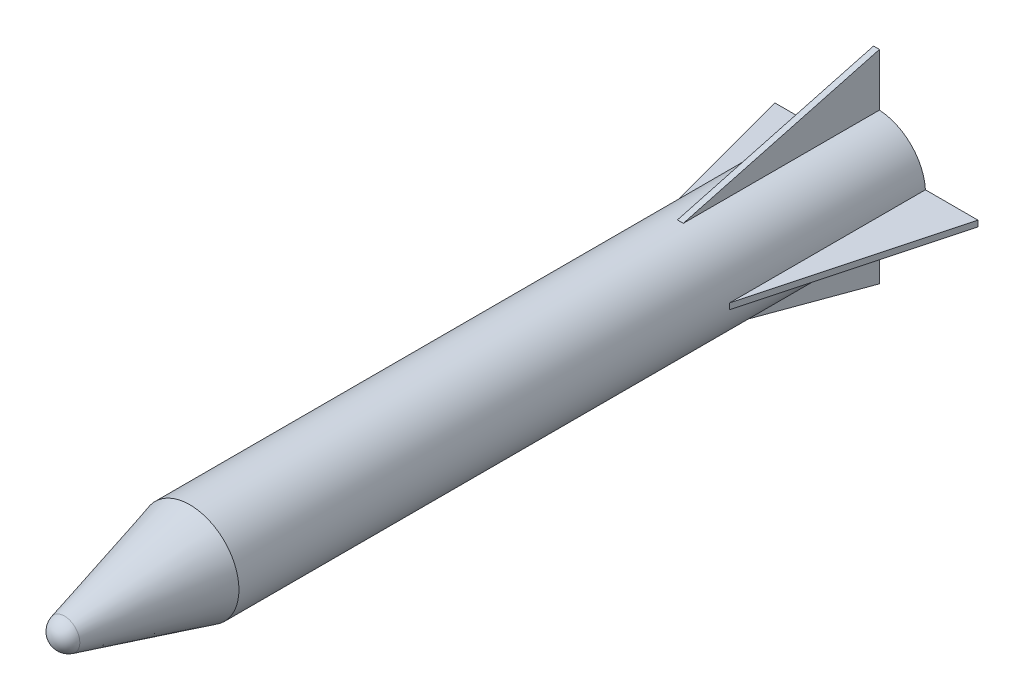
ISO-10303-21;
HEADER;
FILE_DESCRIPTION(('STEP AP214'),'2;1');
FILE_NAME('part.step','',(''),(''),'','','');
FILE_SCHEMA(('AUTOMOTIVE_DESIGN { 1 0 10303 214 1 1 1 1 }'));
ENDSEC;
DATA;
#1=APPLICATION_CONTEXT('core data for automotive mechanical design processes');
#2=APPLICATION_PROTOCOL_DEFINITION('international standard','automotive_design',2000,#1);
#3=PRODUCT_CONTEXT('',#1,'mechanical');
#4=PRODUCT('Part','Part','',(#3));
#5=PRODUCT_RELATED_PRODUCT_CATEGORY('part','',(#4));
#6=PRODUCT_DEFINITION_FORMATION('','',#4);
#7=PRODUCT_DEFINITION_CONTEXT('part definition',#1,'design');
#8=PRODUCT_DEFINITION('design','',#6,#7);
#9=PRODUCT_DEFINITION_SHAPE('','',#8);
#10=(LENGTH_UNIT() NAMED_UNIT(*) SI_UNIT(.MILLI.,.METRE.));
#11=(NAMED_UNIT(*) PLANE_ANGLE_UNIT() SI_UNIT($,.RADIAN.));
#12=(NAMED_UNIT(*) SI_UNIT($,.STERADIAN.) SOLID_ANGLE_UNIT());
#13=UNCERTAINTY_MEASURE_WITH_UNIT(LENGTH_MEASURE(1.E-05),#10,'distance_accuracy_value','');
#14=(GEOMETRIC_REPRESENTATION_CONTEXT(3) GLOBAL_UNCERTAINTY_ASSIGNED_CONTEXT((#13)) GLOBAL_UNIT_ASSIGNED_CONTEXT((#10,
#11,#12)) REPRESENTATION_CONTEXT('',''));
#15=CARTESIAN_POINT('',(0.,0.,0.));
#16=DIRECTION('',(0.,0.,1.));
#17=DIRECTION('',(1.,0.,0.));
#18=AXIS2_PLACEMENT_3D('',#15,#16,#17);
#19=CARTESIAN_POINT('',(0.,-9.5,0.));
#20=DIRECTION('',(0.,0.,1.));
#21=DIRECTION('',(1.,0.,0.));
#22=AXIS2_PLACEMENT_3D('',#19,#20,#21);
#23=PLANE('',#22);
#24=CARTESIAN_POINT('',(0.,0.,0.));
#25=DIRECTION('',(0.,0.,-1.));
#26=DIRECTION('',(-1.,0.,0.));
#27=AXIS2_PLACEMENT_3D('',#24,#25,#26);
#28=CIRCLE('',#27,9.5);
#29=CARTESIAN_POINT('',(-9.5,0.,0.));
#30=VERTEX_POINT('',#29);
#31=EDGE_CURVE('E11',#30,#30,#28,.T.);
#32=ORIENTED_EDGE('',*,*,#31,.F.);
#33=EDGE_LOOP('',(#32));
#34=FACE_BOUND('',#33,.T.);
#35=DIRECTION('',(-1.,0.,0.));
#36=VECTOR('',#35,1.);
#37=CARTESIAN_POINT('',(25.8759393350242,25.8749393350242,0.));
#38=LINE('',#37,#36);
#39=CARTESIAN_POINT('',(0.749999999999897,25.8749393350242,0.));
#40=VERTEX_POINT('',#39);
#41=CARTESIAN_POINT('',(0.,25.8749393350242,0.));
#42=VERTEX_POINT('',#41);
#43=EDGE_CURVE('E177',#40,#42,#38,.T.);
#44=ORIENTED_EDGE('',*,*,#43,.F.);
#45=DIRECTION('',(0.,1.,0.));
#46=VECTOR('',#45,1.);
#47=CARTESIAN_POINT('',(0.750000000000045,-12.502,0.));
#48=LINE('',#47,#46);
#49=CARTESIAN_POINT('',(0.749999999999957,12.4774797134678,0.));
#50=VERTEX_POINT('',#49);
#51=EDGE_CURVE('E64',#50,#40,#48,.T.);
#52=ORIENTED_EDGE('',*,*,#51,.F.);
#53=CARTESIAN_POINT('',(0.,0.,0.));
#54=DIRECTION('',(0.,0.,-1.));
#55=DIRECTION('',(-1.,0.,0.));
#56=AXIS2_PLACEMENT_3D('',#53,#54,#55);
#57=CIRCLE('',#56,12.5);
#58=CARTESIAN_POINT('',(12.4774797134678,0.750000000000001,0.));
#59=VERTEX_POINT('',#58);
#60=EDGE_CURVE('E284',#50,#59,#57,.T.);
#61=ORIENTED_EDGE('',*,*,#60,.T.);
#62=DIRECTION('',(1.,0.,0.));
#63=VECTOR('',#62,1.);
#64=CARTESIAN_POINT('',(-12.502,0.750000000000001,0.));
#65=LINE('',#64,#63);
#66=CARTESIAN_POINT('',(25.8749393350242,0.750000000000001,0.));
#67=VERTEX_POINT('',#66);
#68=EDGE_CURVE('E256',#59,#67,#65,.T.);
#69=ORIENTED_EDGE('',*,*,#68,.T.);
#70=DIRECTION('',(0.,1.,0.));
#71=VECTOR('',#70,1.);
#72=CARTESIAN_POINT('',(25.8749393350242,-12.501,0.));
#73=LINE('',#72,#71);
#74=CARTESIAN_POINT('',(25.8749393350242,0.,0.));
#75=VERTEX_POINT('',#74);
#76=EDGE_CURVE('E244',#75,#67,#73,.T.);
#77=ORIENTED_EDGE('',*,*,#76,.F.);
#78=CARTESIAN_POINT('',(25.8749393350242,-0.750000000000001,0.));
#79=VERTEX_POINT('',#78);
#80=EDGE_CURVE('E245',#79,#75,#73,.T.);
#81=ORIENTED_EDGE('',*,*,#80,.F.);
#82=DIRECTION('',(1.,0.,0.));
#83=VECTOR('',#82,1.);
#84=CARTESIAN_POINT('',(-12.502,-0.750000000000001,0.));
#85=LINE('',#84,#83);
#86=CARTESIAN_POINT('',(12.4774797134678,-0.750000000000001,0.));
#87=VERTEX_POINT('',#86);
#88=EDGE_CURVE('E261',#87,#79,#85,.T.);
#89=ORIENTED_EDGE('',*,*,#88,.F.);
#90=CARTESIAN_POINT('',(0.750000000000132,-12.4774797134678,0.));
#91=VERTEX_POINT('',#90);
#92=EDGE_CURVE('E57',#87,#91,#57,.T.);
#93=ORIENTED_EDGE('',*,*,#92,.T.);
#94=DIRECTION('',(0.,-1.,0.));
#95=VECTOR('',#94,1.);
#96=CARTESIAN_POINT('',(0.74999999999987,12.502,0.));
#97=LINE('',#96,#95);
#98=CARTESIAN_POINT('',(0.750000000000272,-25.8749393350241,0.));
#99=VERTEX_POINT('',#98);
#100=EDGE_CURVE('E225',#91,#99,#97,.T.);
#101=ORIENTED_EDGE('',*,*,#100,.T.);
#102=DIRECTION('',(1.,0.,0.));
#103=VECTOR('',#102,1.);
#104=CARTESIAN_POINT('',(-33.0010000000001,-25.8749393350245,0.));
#105=LINE('',#104,#103);
#106=CARTESIAN_POINT('',(2.35922392732846E-13,-25.8749393350242,0.));
#107=VERTEX_POINT('',#106);
#108=EDGE_CURVE('E318',#107,#99,#105,.T.);
#109=ORIENTED_EDGE('',*,*,#108,.F.);
#110=CARTESIAN_POINT('',(-0.749999999999695,-25.8749393350242,0.));
#111=VERTEX_POINT('',#110);
#112=EDGE_CURVE('E305',#111,#107,#105,.T.);
#113=ORIENTED_EDGE('',*,*,#112,.F.);
#114=DIRECTION('',(0.,-1.,0.));
#115=VECTOR('',#114,1.);
#116=CARTESIAN_POINT('',(-0.750000000000132,12.502,0.));
#117=LINE('',#116,#115);
#118=CARTESIAN_POINT('',(-0.749999999999871,-12.4774797134678,0.));
#119=VERTEX_POINT('',#118);
#120=EDGE_CURVE('E233',#119,#111,#117,.T.);
#121=ORIENTED_EDGE('',*,*,#120,.F.);
#122=CARTESIAN_POINT('',(-12.4774797134678,-0.750000000000001,0.));
#123=VERTEX_POINT('',#122);
#124=EDGE_CURVE('E286',#119,#123,#57,.T.);
#125=ORIENTED_EDGE('',*,*,#124,.T.);
#126=DIRECTION('',(-1.,0.,0.));
#127=VECTOR('',#126,1.);
#128=CARTESIAN_POINT('',(25.8769393350242,-0.750000000000001,0.));
#129=LINE('',#128,#127);
#130=CARTESIAN_POINT('',(-25.8749393350242,-0.750000000000001,0.));
#131=VERTEX_POINT('',#130);
#132=EDGE_CURVE('E216',#123,#131,#129,.T.);
#133=ORIENTED_EDGE('',*,*,#132,.T.);
#134=DIRECTION('',(0.,-1.,0.));
#135=VECTOR('',#134,1.);
#136=CARTESIAN_POINT('',(-25.8749393350242,33.001,0.));
#137=LINE('',#136,#135);
#138=CARTESIAN_POINT('',(-25.8749393350242,0.,0.));
#139=VERTEX_POINT('',#138);
#140=EDGE_CURVE('E303',#139,#131,#137,.T.);
#141=ORIENTED_EDGE('',*,*,#140,.F.);
#142=CARTESIAN_POINT('',(-25.8749393350242,0.750000000000001,0.));
#143=VERTEX_POINT('',#142);
#144=EDGE_CURVE('E310',#143,#139,#137,.T.);
#145=ORIENTED_EDGE('',*,*,#144,.F.);
#146=DIRECTION('',(-1.,0.,0.));
#147=VECTOR('',#146,1.);
#148=CARTESIAN_POINT('',(25.8769393350242,0.750000000000001,0.));
#149=LINE('',#148,#147);
#150=CARTESIAN_POINT('',(-12.4774797134678,0.750000000000001,0.));
#151=VERTEX_POINT('',#150);
#152=EDGE_CURVE('E71',#151,#143,#149,.T.);
#153=ORIENTED_EDGE('',*,*,#152,.F.);
#154=CARTESIAN_POINT('',(-0.750000000000045,12.4774797134678,0.));
#155=VERTEX_POINT('',#154);
#156=EDGE_CURVE('E289',#151,#155,#57,.T.);
#157=ORIENTED_EDGE('',*,*,#156,.T.);
#158=DIRECTION('',(0.,1.,0.));
#159=VECTOR('',#158,1.);
#160=CARTESIAN_POINT('',(-0.749999999999958,-12.502,0.));
#161=LINE('',#160,#159);
#162=CARTESIAN_POINT('',(-0.750000000000091,25.8749393350242,0.));
#163=VERTEX_POINT('',#162);
#164=EDGE_CURVE('E192',#155,#163,#161,.T.);
#165=ORIENTED_EDGE('',*,*,#164,.T.);
#166=EDGE_CURVE('E184',#42,#163,#38,.T.);
#167=ORIENTED_EDGE('',*,*,#166,.F.);
#168=EDGE_LOOP('',(#44,#52,#61,#69,#77,#81,#89,#93,#101,#109,#113,#121,#125,#133,#141,#145,#153,
#157,#165,#167));
#169=FACE_BOUND('',#168,.T.);
#170=ADVANCED_FACE('F48',(#34,#169),#23,.F.);
#171=CARTESIAN_POINT('',(0.749999999999866,12.502,50.));
#172=DIRECTION('',(1.,0.,0.));
#173=DIRECTION('',(0.,1.,0.));
#174=AXIS2_PLACEMENT_3D('',#171,#172,#173);
#175=PLANE('',#174);
#176=DIRECTION('',(0.,0.,-1.));
#177=VECTOR('',#176,1.);
#178=CARTESIAN_POINT('',(0.750000000000132,-12.4774797134678,0.));
#179=LINE('',#178,#177);
#180=CARTESIAN_POINT('',(0.750000000000125,-12.4774797134678,50.));
#181=VERTEX_POINT('',#180);
#182=EDGE_CURVE('E176',#91,#181,#179,.F.);
#183=ORIENTED_EDGE('',*,*,#182,.T.);
#184=DIRECTION('',(0.,-0.258819045102525,-0.965925826289067));
#185=VECTOR('',#184,1.);
#186=CARTESIAN_POINT('',(0.750000000000125,-12.4774797134678,50.));
#187=LINE('',#186,#185);
#188=EDGE_CURVE('E315',#181,#99,#187,.T.);
#189=ORIENTED_EDGE('',*,*,#188,.T.);
#190=ORIENTED_EDGE('',*,*,#100,.F.);
#191=EDGE_LOOP('',(#183,#189,#190));
#192=FACE_BOUND('',#191,.T.);
#193=ADVANCED_FACE('F339',(#192),#175,.T.);
#194=CARTESIAN_POINT('',(-0.750000000000132,12.502,0.));
#195=DIRECTION('',(-1.,0.,0.));
#196=DIRECTION('',(0.,-1.,0.));
#197=AXIS2_PLACEMENT_3D('',#194,#195,#196);
#198=PLANE('',#197);
#199=ORIENTED_EDGE('',*,*,#120,.T.);
#200=DIRECTION('',(0.,-0.258819045102525,-0.965925826289067));
#201=VECTOR('',#200,1.);
#202=CARTESIAN_POINT('',(-0.749999999999869,-12.4774797134678,50.));
#203=LINE('',#202,#201);
#204=CARTESIAN_POINT('',(-0.749999999999871,-12.4774797134678,50.));
#205=VERTEX_POINT('',#204);
#206=EDGE_CURVE('E313',#205,#111,#203,.T.);
#207=ORIENTED_EDGE('',*,*,#206,.F.);
#208=DIRECTION('',(0.,0.,-1.));
#209=VECTOR('',#208,1.);
#210=CARTESIAN_POINT('',(-0.749999999999871,-12.4774797134678,0.));
#211=LINE('',#210,#209);
#212=EDGE_CURVE('E222',#205,#119,#211,.T.);
#213=ORIENTED_EDGE('',*,*,#212,.T.);
#214=EDGE_LOOP('',(#199,#207,#213));
#215=FACE_BOUND('',#214,.T.);
#216=ADVANCED_FACE('F346',(#215),#198,.T.);
#217=CARTESIAN_POINT('',(25.8769393350242,-0.749999999999997,50.));
#218=DIRECTION('',(0.,-1.,0.));
#219=DIRECTION('',(0.,0.,-1.));
#220=AXIS2_PLACEMENT_3D('',#217,#218,#219);
#221=PLANE('',#220);
#222=DIRECTION('',(0.,0.,-1.));
#223=VECTOR('',#222,1.);
#224=CARTESIAN_POINT('',(-12.4774797134678,-0.750000000000001,0.));
#225=LINE('',#224,#223);
#226=CARTESIAN_POINT('',(-12.4774797134678,-0.749999999999995,50.));
#227=VERTEX_POINT('',#226);
#228=EDGE_CURVE('E207',#123,#227,#225,.F.);
#229=ORIENTED_EDGE('',*,*,#228,.T.);
#230=DIRECTION('',(-0.258819045102525,0.,-0.965925826289067));
#231=VECTOR('',#230,1.);
#232=CARTESIAN_POINT('',(-12.4774797134678,-0.749999999999995,50.));
#233=LINE('',#232,#231);
#234=EDGE_CURVE('E299',#227,#131,#233,.T.);
#235=ORIENTED_EDGE('',*,*,#234,.T.);
#236=ORIENTED_EDGE('',*,*,#132,.F.);
#237=EDGE_LOOP('',(#229,#235,#236));
#238=FACE_BOUND('',#237,.T.);
#239=ADVANCED_FACE('F350',(#238),#221,.T.);
#240=CARTESIAN_POINT('',(25.8769393350242,0.750000000000001,0.));
#241=DIRECTION('',(0.,1.,0.));
#242=DIRECTION('',(0.,0.,1.));
#243=AXIS2_PLACEMENT_3D('',#240,#241,#242);
#244=PLANE('',#243);
#245=ORIENTED_EDGE('',*,*,#152,.T.);
#246=DIRECTION('',(-0.258819045102525,0.,-0.965925826289067));
#247=VECTOR('',#246,1.);
#248=CARTESIAN_POINT('',(-12.4774797134678,0.750000000000001,50.));
#249=LINE('',#248,#247);
#250=CARTESIAN_POINT('',(-12.4774797134678,0.750000000000001,50.));
#251=VERTEX_POINT('',#250);
#252=EDGE_CURVE('E297',#251,#143,#249,.T.);
#253=ORIENTED_EDGE('',*,*,#252,.F.);
#254=DIRECTION('',(0.,0.,-1.));
#255=VECTOR('',#254,1.);
#256=CARTESIAN_POINT('',(-12.4774797134678,0.750000000000001,0.));
#257=LINE('',#256,#255);
#258=EDGE_CURVE('E214',#251,#151,#257,.T.);
#259=ORIENTED_EDGE('',*,*,#258,.T.);
#260=EDGE_LOOP('',(#245,#253,#259));
#261=FACE_BOUND('',#260,.T.);
#262=ADVANCED_FACE('F296',(#261),#244,.T.);
#263=CARTESIAN_POINT('',(-0.749999999999953,-12.502,50.));
#264=DIRECTION('',(-1.,0.,0.));
#265=DIRECTION('',(0.,-1.,0.));
#266=AXIS2_PLACEMENT_3D('',#263,#264,#265);
#267=PLANE('',#266);
#268=DIRECTION('',(0.,0.,-1.));
#269=VECTOR('',#268,1.);
#270=CARTESIAN_POINT('',(-0.750000000000045,12.4774797134678,0.));
#271=LINE('',#270,#269);
#272=CARTESIAN_POINT('',(-0.750000000000038,12.4774797134678,50.));
#273=VERTEX_POINT('',#272);
#274=EDGE_CURVE('E190',#155,#273,#271,.F.);
#275=ORIENTED_EDGE('',*,*,#274,.T.);
#276=DIRECTION('',(0.,0.258819045102525,-0.965925826289067));
#277=VECTOR('',#276,1.);
#278=CARTESIAN_POINT('',(-0.750000000000038,12.4774797134678,50.));
#279=LINE('',#278,#277);
#280=EDGE_CURVE('E180',#273,#163,#279,.T.);
#281=ORIENTED_EDGE('',*,*,#280,.T.);
#282=ORIENTED_EDGE('',*,*,#164,.F.);
#283=EDGE_LOOP('',(#275,#281,#282));
#284=FACE_BOUND('',#283,.T.);
#285=ADVANCED_FACE('F191',(#284),#267,.T.);
#286=CARTESIAN_POINT('',(0.750000000000045,-12.502,0.));
#287=DIRECTION('',(1.,0.,0.));
#288=DIRECTION('',(0.,1.,0.));
#289=AXIS2_PLACEMENT_3D('',#286,#287,#288);
#290=PLANE('',#289);
#291=ORIENTED_EDGE('',*,*,#51,.T.);
#292=DIRECTION('',(0.,0.258819045102525,-0.965925826289067));
#293=VECTOR('',#292,1.);
#294=CARTESIAN_POINT('',(0.749999999999959,12.4774797134678,50.));
#295=LINE('',#294,#293);
#296=CARTESIAN_POINT('',(0.749999999999958,12.4774797134678,50.));
#297=VERTEX_POINT('',#296);
#298=EDGE_CURVE('E187',#297,#40,#295,.T.);
#299=ORIENTED_EDGE('',*,*,#298,.F.);
#300=DIRECTION('',(0.,0.,-1.));
#301=VECTOR('',#300,1.);
#302=CARTESIAN_POINT('',(0.749999999999957,12.4774797134678,0.));
#303=LINE('',#302,#301);
#304=EDGE_CURVE('E201',#297,#50,#303,.T.);
#305=ORIENTED_EDGE('',*,*,#304,.T.);
#306=EDGE_LOOP('',(#291,#299,#305));
#307=FACE_BOUND('',#306,.T.);
#308=ADVANCED_FACE('F322',(#307),#290,.T.);
#309=CARTESIAN_POINT('',(-12.502,0.749999999999997,50.));
#310=DIRECTION('',(0.,1.,0.));
#311=DIRECTION('',(0.,0.,1.));
#312=AXIS2_PLACEMENT_3D('',#309,#310,#311);
#313=PLANE('',#312);
#314=DIRECTION('',(0.,0.,-1.));
#315=VECTOR('',#314,1.);
#316=CARTESIAN_POINT('',(12.4774797134678,0.750000000000001,0.));
#317=LINE('',#316,#315);
#318=CARTESIAN_POINT('',(12.4774797134678,0.749999999999995,50.));
#319=VERTEX_POINT('',#318);
#320=EDGE_CURVE('E249',#59,#319,#317,.F.);
#321=ORIENTED_EDGE('',*,*,#320,.T.);
#322=DIRECTION('',(0.258819045102525,0.,-0.965925826289067));
#323=VECTOR('',#322,1.);
#324=CARTESIAN_POINT('',(12.4774797134678,0.749999999999995,50.));
#325=LINE('',#324,#323);
#326=EDGE_CURVE('E240',#319,#67,#325,.T.);
#327=ORIENTED_EDGE('',*,*,#326,.T.);
#328=ORIENTED_EDGE('',*,*,#68,.F.);
#329=EDGE_LOOP('',(#321,#327,#328));
#330=FACE_BOUND('',#329,.T.);
#331=ADVANCED_FACE('F327',(#330),#313,.T.);
#332=CARTESIAN_POINT('',(-12.502,-0.750000000000001,0.));
#333=DIRECTION('',(0.,-1.,0.));
#334=DIRECTION('',(0.,0.,-1.));
#335=AXIS2_PLACEMENT_3D('',#332,#333,#334);
#336=PLANE('',#335);
#337=ORIENTED_EDGE('',*,*,#88,.T.);
#338=DIRECTION('',(0.258819045102525,0.,-0.965925826289067));
#339=VECTOR('',#338,1.);
#340=CARTESIAN_POINT('',(12.4774797134678,-0.750000000000001,50.));
#341=LINE('',#340,#339);
#342=CARTESIAN_POINT('',(12.4774797134678,-0.750000000000001,50.));
#343=VERTEX_POINT('',#342);
#344=EDGE_CURVE('E238',#343,#79,#341,.T.);
#345=ORIENTED_EDGE('',*,*,#344,.F.);
#346=DIRECTION('',(0.,0.,-1.));
#347=VECTOR('',#346,1.);
#348=CARTESIAN_POINT('',(12.4774797134678,-0.750000000000001,0.));
#349=LINE('',#348,#347);
#350=EDGE_CURVE('E253',#343,#87,#349,.T.);
#351=ORIENTED_EDGE('',*,*,#350,.T.);
#352=EDGE_LOOP('',(#337,#345,#351));
#353=FACE_BOUND('',#352,.T.);
#354=ADVANCED_FACE('F334',(#353),#336,.T.);
#355=CARTESIAN_POINT('',(0.,0.,0.));
#356=DIRECTION('',(0.,0.,-1.));
#357=DIRECTION('',(-1.,0.,0.));
#358=AXIS2_PLACEMENT_3D('',#355,#356,#357);
#359=CYLINDRICAL_SURFACE('',#358,9.5);
#360=CARTESIAN_POINT('',(0.,0.,70.));
#361=DIRECTION('',(0.,0.,-1.));
#362=DIRECTION('',(-1.,0.,0.));
#363=AXIS2_PLACEMENT_3D('',#360,#361,#362);
#364=CIRCLE('',#363,9.5);
#365=CARTESIAN_POINT('',(-9.5,0.,70.));
#366=VERTEX_POINT('',#365);
#367=EDGE_CURVE('E260',#366,#366,#364,.T.);
#368=ORIENTED_EDGE('',*,*,#367,.F.);
#369=EDGE_LOOP('',(#368));
#370=FACE_BOUND('',#369,.T.);
#371=ORIENTED_EDGE('',*,*,#31,.T.);
#372=EDGE_LOOP('',(#371));
#373=FACE_BOUND('',#372,.T.);
#374=ADVANCED_FACE('F50',(#370,#373),#359,.F.);
#375=CARTESIAN_POINT('',(0.,0.,0.));
#376=DIRECTION('',(0.,0.,-1.));
#377=DIRECTION('',(-1.,0.,0.));
#378=AXIS2_PLACEMENT_3D('',#375,#376,#377);
#379=CYLINDRICAL_SURFACE('',#378,12.5);
#380=CARTESIAN_POINT('',(0.,0.,50.));
#381=DIRECTION('',(0.,0.,1.));
#382=DIRECTION('',(1.,0.,0.));
#383=AXIS2_PLACEMENT_3D('',#380,#381,#382);
#384=CIRCLE('',#383,12.5);
#385=EDGE_CURVE('E173',#273,#297,#384,.F.);
#386=ORIENTED_EDGE('',*,*,#385,.F.);
#387=ORIENTED_EDGE('',*,*,#274,.F.);
#388=ORIENTED_EDGE('',*,*,#156,.F.);
#389=ORIENTED_EDGE('',*,*,#258,.F.);
#390=CARTESIAN_POINT('',(0.,0.,50.));
#391=DIRECTION('',(0.,0.,1.));
#392=DIRECTION('',(1.,0.,0.));
#393=AXIS2_PLACEMENT_3D('',#390,#391,#392);
#394=CIRCLE('',#393,12.5);
#395=EDGE_CURVE('E210',#227,#251,#394,.F.);
#396=ORIENTED_EDGE('',*,*,#395,.F.);
#397=ORIENTED_EDGE('',*,*,#228,.F.);
#398=ORIENTED_EDGE('',*,*,#124,.F.);
#399=ORIENTED_EDGE('',*,*,#212,.F.);
#400=CARTESIAN_POINT('',(0.,0.,50.));
#401=DIRECTION('',(0.,0.,1.));
#402=DIRECTION('',(1.,0.,0.));
#403=AXIS2_PLACEMENT_3D('',#400,#401,#402);
#404=CIRCLE('',#403,12.5);
#405=EDGE_CURVE('E226',#181,#205,#404,.F.);
#406=ORIENTED_EDGE('',*,*,#405,.F.);
#407=ORIENTED_EDGE('',*,*,#182,.F.);
#408=ORIENTED_EDGE('',*,*,#92,.F.);
#409=ORIENTED_EDGE('',*,*,#350,.F.);
#410=CARTESIAN_POINT('',(0.,0.,50.));
#411=DIRECTION('',(0.,0.,1.));
#412=DIRECTION('',(1.,0.,0.));
#413=AXIS2_PLACEMENT_3D('',#410,#411,#412);
#414=CIRCLE('',#413,12.5);
#415=EDGE_CURVE('E252',#319,#343,#414,.F.);
#416=ORIENTED_EDGE('',*,*,#415,.F.);
#417=ORIENTED_EDGE('',*,*,#320,.F.);
#418=ORIENTED_EDGE('',*,*,#60,.F.);
#419=ORIENTED_EDGE('',*,*,#304,.F.);
#420=EDGE_LOOP('',(#386,#387,#388,#389,#396,#397,#398,#399,#406,#407,#408,#409,#416,#417,#418,#419));
#421=FACE_BOUND('',#420,.T.);
#422=CARTESIAN_POINT('',(0.,0.,175.));
#423=DIRECTION('',(0.,0.,-1.));
#424=DIRECTION('',(-1.,0.,0.));
#425=AXIS2_PLACEMENT_3D('',#422,#423,#424);
#426=CIRCLE('',#425,12.5);
#427=CARTESIAN_POINT('',(-12.5,0.,175.));
#428=VERTEX_POINT('',#427);
#429=EDGE_CURVE('E282',#428,#428,#426,.T.);
#430=ORIENTED_EDGE('',*,*,#429,.T.);
#431=EDGE_LOOP('',(#430));
#432=FACE_BOUND('',#431,.T.);
#433=ADVANCED_FACE('F198',(#421,#432),#379,.T.);
#434=CARTESIAN_POINT('',(0.,0.,206.984593749975));
#435=DIRECTION('',(0.,0.,-1.));
#436=DIRECTION('',(-1.,0.,0.));
#437=AXIS2_PLACEMENT_3D('',#434,#435,#436);
#438=CONICAL_SURFACE('',#437,3.92975393445672,0.26179938779915);
#439=CARTESIAN_POINT('',(0.,0.,206.984593749975));
#440=DIRECTION('',(0.,0.,-1.));
#441=DIRECTION('',(-1.,0.,0.));
#442=AXIS2_PLACEMENT_3D('',#439,#440,#441);
#443=CIRCLE('',#442,3.92975393445672);
#444=CARTESIAN_POINT('',(-3.92975393445672,0.,206.984593749975));
#445=VERTEX_POINT('',#444);
#446=EDGE_CURVE('E279',#445,#445,#443,.T.);
#447=CARTESIAN_POINT('',(-12.5,0.,175.));
#448=CARTESIAN_POINT('',(-12.410726603484,0.,175.333172851562));
#449=CARTESIAN_POINT('',(-12.3214532069679,0.,175.666345703124));
#450=CARTESIAN_POINT('',(-12.1429064139357,0.,176.332691406249));
#451=CARTESIAN_POINT('',(-12.0536330174196,0.,176.665864257811));
#452=CARTESIAN_POINT('',(-11.8750862243875,0.,177.332209960936));
#453=CARTESIAN_POINT('',(-11.7858128278714,0.,177.665382812498));
#454=CARTESIAN_POINT('',(-11.6072660348393,0.,178.331728515622));
#455=CARTESIAN_POINT('',(-11.5179926383232,0.,178.664901367185));
#456=CARTESIAN_POINT('',(-11.339445845291,0.,179.331247070309));
#457=CARTESIAN_POINT('',(-11.250172448775,0.,179.664419921871));
#458=CARTESIAN_POINT('',(-11.0716256557428,0.,180.330765624996));
#459=CARTESIAN_POINT('',(-10.9823522592267,0.,180.663938476558));
#460=CARTESIAN_POINT('',(-10.8038054661946,0.,181.330284179683));
#461=CARTESIAN_POINT('',(-10.7145320696785,0.,181.663457031245));
#462=CARTESIAN_POINT('',(-10.5359852766464,0.,182.329802734369));
#463=CARTESIAN_POINT('',(-10.4467118801303,0.,182.662975585931));
#464=CARTESIAN_POINT('',(-10.2681650870981,0.,183.329321289056));
#465=CARTESIAN_POINT('',(-10.1788916905821,0.,183.662494140618));
#466=CARTESIAN_POINT('',(-10.0003448975499,0.,184.328839843743));
#467=CARTESIAN_POINT('',(-9.91107150103382,0.,184.662012695305));
#468=CARTESIAN_POINT('',(-9.73252470800167,0.,185.328358398429));
#469=CARTESIAN_POINT('',(-9.64325131148559,0.,185.661531249992));
#470=CARTESIAN_POINT('',(-9.46470451845344,0.,186.327876953116));
#471=CARTESIAN_POINT('',(-9.37543112193736,0.,186.661049804678));
#472=CARTESIAN_POINT('',(-9.19688432890521,0.,187.327395507803));
#473=CARTESIAN_POINT('',(-9.10761093238914,0.,187.660568359365));
#474=CARTESIAN_POINT('',(-8.92906413935698,0.,188.32691406249));
#475=CARTESIAN_POINT('',(-8.83979074284091,0.,188.660086914052));
#476=CARTESIAN_POINT('',(-8.66124394980876,0.,189.326432617176));
#477=CARTESIAN_POINT('',(-8.57197055329268,0.,189.659605468739));
#478=CARTESIAN_POINT('',(-8.39342376026053,0.,190.325951171863));
#479=CARTESIAN_POINT('',(-8.30415036374445,0.,190.659124023425));
#480=CARTESIAN_POINT('',(-8.1256035707123,0.,191.32546972655));
#481=CARTESIAN_POINT('',(-8.03633017419622,0.,191.658642578112));
#482=CARTESIAN_POINT('',(-7.85778338116407,0.,192.324988281236));
#483=CARTESIAN_POINT('',(-7.76850998464799,0.,192.658161132799));
#484=CARTESIAN_POINT('',(-7.58996319161584,0.,193.324506835923));
#485=CARTESIAN_POINT('',(-7.50068979509976,0.,193.657679687485));
#486=CARTESIAN_POINT('',(-7.32214300206761,0.,194.32402539061));
#487=CARTESIAN_POINT('',(-7.23286960555154,0.,194.657198242172));
#488=CARTESIAN_POINT('',(-7.05432281251938,0.,195.323543945297));
#489=CARTESIAN_POINT('',(-6.96504941600331,0.,195.656716796859));
#490=CARTESIAN_POINT('',(-6.78650262297116,0.,196.323062499983));
#491=CARTESIAN_POINT('',(-6.69722922645508,0.,196.656235351545));
#492=CARTESIAN_POINT('',(-6.51868243342293,0.,197.32258105467));
#493=CARTESIAN_POINT('',(-6.42940903690685,0.,197.655753906232));
#494=CARTESIAN_POINT('',(-6.2508622438747,0.,198.322099609357));
#495=CARTESIAN_POINT('',(-6.16158884735862,0.,198.655272460919));
#496=CARTESIAN_POINT('',(-5.98304205432647,0.,199.321618164043));
#497=CARTESIAN_POINT('',(-5.89376865781039,0.,199.654791015606));
#498=CARTESIAN_POINT('',(-5.71522186477824,0.,200.32113671873));
#499=CARTESIAN_POINT('',(-5.62594846826216,0.,200.654309570292));
#500=CARTESIAN_POINT('',(-5.44740167523001,0.,201.320655273417));
#501=CARTESIAN_POINT('',(-5.35812827871394,0.,201.653828124979));
#502=CARTESIAN_POINT('',(-5.17958148568178,0.,202.320173828104));
#503=CARTESIAN_POINT('',(-5.09030808916571,0.,202.653346679666));
#504=CARTESIAN_POINT('',(-4.91176129613356,0.,203.31969238279));
#505=CARTESIAN_POINT('',(-4.82248789961748,0.,203.652865234353));
#506=CARTESIAN_POINT('',(-4.64394110658533,0.,204.319210937477));
#507=CARTESIAN_POINT('',(-4.55466771006925,0.,204.652383789039));
#508=CARTESIAN_POINT('',(-4.3761209170371,0.,205.318729492164));
#509=CARTESIAN_POINT('',(-4.28684752052102,0.,205.651902343726));
#510=CARTESIAN_POINT('',(-4.10830072748887,0.,206.31824804685));
#511=CARTESIAN_POINT('',(-4.01902733097279,0.,206.651420898413));
#512=CARTESIAN_POINT('',(-3.92975393445672,0.,206.984593749975));
#513=B_SPLINE_CURVE_WITH_KNOTS('',3,(#447,#448,#449,#450,#451,#452,#453,#454,#455,#456,#457,
#458,#459,#460,#461,#462,#463,#464,#465,#466,#467,#468,#469,#470,#471,#472,#473,#474,#475,#476,
#477,#478,#479,#480,#481,#482,#483,#484,#485,#486,#487,#488,#489,#490,#491,#492,#493,#494,#495,
#496,#497,#498,#499,#500,#501,#502,#503,#504,#505,#506,#507,#508,#509,#510,#511,#512),
.UNSPECIFIED.,.F.,.F.,(4,2,2,2,2,2,2,2,2,2,2,2,2,2,2,2,2,2,2,2,2,2,2,2,2,2,2,2,2,2,2,2,4),(0.,
1.03477775154507,2.06955550309014,3.10433325463522,4.13911100618029,5.17388875772536,
6.20866650927043,7.24344426081551,8.27822201236058,9.31299976390562,10.3477775154507,
11.3825552669958,12.4173330185408,13.4521107700859,14.486888521631,15.5216662731761,
16.5564440247211,17.5912217762662,18.6259995278112,19.6607772793563,20.6955550309014,
21.7303327824465,22.7651105339915,23.7998882855366,24.8346660370817,25.8694437886267,
26.9042215401718,27.9389992917169,28.973777043262,30.008554794807,31.0433325463521,
32.0781102978972,33.1128880494422),.UNSPECIFIED.);
#514=EDGE_CURVE('BSEAM376',#428,#445,#513,.T.);
#515=ORIENTED_EDGE('',*,*,#429,.F.);
#516=ORIENTED_EDGE('',*,*,#446,.T.);
#517=ORIENTED_EDGE('',*,*,#514,.T.);
#518=ORIENTED_EDGE('',*,*,#514,.F.);
#519=EDGE_LOOP('',(#515,#517,#516,#518));
#520=FACE_BOUND('',#519,.T.);
#521=ADVANCED_FACE('F376',(#520),#438,.T.);
#522=CARTESIAN_POINT('',(0.,0.,205.931619356784));
#523=DIRECTION('',(0.,0.,-1.));
#524=DIRECTION('',(0.,-1.,0.));
#525=AXIS2_PLACEMENT_3D('',#522,#523,#524);
#526=SPHERICAL_SURFACE('',#525,4.06838064321585);
#527=ORIENTED_EDGE('',*,*,#446,.F.);
#528=EDGE_LOOP('',(#527));
#529=FACE_BOUND('',#528,.T.);
#530=ADVANCED_FACE('F379',(#529),#526,.T.);
#531=CARTESIAN_POINT('',(0.,0.,70.));
#532=DIRECTION('',(0.,0.,-1.));
#533=DIRECTION('',(-1.,0.,0.));
#534=AXIS2_PLACEMENT_3D('',#531,#532,#533);
#535=CONICAL_SURFACE('',#534,9.5,0.78539816339745);
#536=CARTESIAN_POINT('',(0.,0.,79.5));
#537=VERTEX_POINT('',#536);
#538=VERTEX_LOOP('',#537);
#539=FACE_BOUND('',#538,.T.);
#540=ORIENTED_EDGE('',*,*,#367,.T.);
#541=EDGE_LOOP('',(#540));
#542=FACE_BOUND('',#541,.T.);
#543=ADVANCED_FACE('F383',(#539,#542),#535,.F.);
#544=CARTESIAN_POINT('',(33.,-12.501,50.));
#545=DIRECTION('',(0.,0.,-1.));
#546=DIRECTION('',(0.,1.,0.));
#547=AXIS2_PLACEMENT_3D('',#544,#545,#546);
#548=PLANE('',#547);
#549=ORIENTED_EDGE('',*,*,#415,.T.);
#550=DIRECTION('',(0.,1.,0.));
#551=VECTOR('',#550,1.);
#552=CARTESIAN_POINT('',(12.4774797134678,-12.501,50.));
#553=LINE('',#552,#551);
#554=EDGE_CURVE('E247',#343,#319,#553,.T.);
#555=ORIENTED_EDGE('',*,*,#554,.T.);
#556=EDGE_LOOP('',(#549,#555));
#557=FACE_BOUND('',#556,.T.);
#558=ADVANCED_FACE('F404',(#557),#548,.T.);
#559=CARTESIAN_POINT('',(12.4774797134678,-12.501,50.));
#560=DIRECTION('',(0.965925826289067,0.,0.258819045102525));
#561=DIRECTION('',(0.258819045102525,0.,-0.965925826289067));
#562=AXIS2_PLACEMENT_3D('',#559,#560,#561);
#563=PLANE('',#562);
#564=ORIENTED_EDGE('',*,*,#344,.T.);
#565=ORIENTED_EDGE('',*,*,#80,.T.);
#566=ORIENTED_EDGE('',*,*,#76,.T.);
#567=ORIENTED_EDGE('',*,*,#326,.F.);
#568=ORIENTED_EDGE('',*,*,#554,.F.);
#569=EDGE_LOOP('',(#564,#565,#566,#567,#568));
#570=FACE_BOUND('',#569,.T.);
#571=ADVANCED_FACE('F412',(#570),#563,.T.);
#572=CARTESIAN_POINT('',(25.8759393350242,33.0000000000001,50.));
#573=DIRECTION('',(0.,0.,-1.));
#574=DIRECTION('',(-1.,0.,0.));
#575=AXIS2_PLACEMENT_3D('',#572,#573,#574);
#576=PLANE('',#575);
#577=DIRECTION('',(-1.,0.,0.));
#578=VECTOR('',#577,1.);
#579=CARTESIAN_POINT('',(25.8759393350242,12.4774797134679,50.));
#580=LINE('',#579,#578);
#581=EDGE_CURVE('E169',#297,#273,#580,.T.);
#582=ORIENTED_EDGE('',*,*,#581,.T.);
#583=ORIENTED_EDGE('',*,*,#385,.T.);
#584=EDGE_LOOP('',(#582,#583));
#585=FACE_BOUND('',#584,.T.);
#586=ADVANCED_FACE('F171',(#585),#576,.T.);
#587=CARTESIAN_POINT('',(25.8759393350242,12.4774797134679,50.));
#588=DIRECTION('',(0.,0.965925826289067,0.258819045102525));
#589=DIRECTION('',(0.,-0.258819045102525,0.965925826289067));
#590=AXIS2_PLACEMENT_3D('',#587,#588,#589);
#591=PLANE('',#590);
#592=ORIENTED_EDGE('',*,*,#298,.T.);
#593=ORIENTED_EDGE('',*,*,#43,.T.);
#594=ORIENTED_EDGE('',*,*,#166,.T.);
#595=ORIENTED_EDGE('',*,*,#280,.F.);
#596=ORIENTED_EDGE('',*,*,#581,.F.);
#597=EDGE_LOOP('',(#592,#593,#594,#595,#596));
#598=FACE_BOUND('',#597,.T.);
#599=ADVANCED_FACE('F182',(#598),#591,.T.);
#600=CARTESIAN_POINT('',(-33.,33.001,50.));
#601=DIRECTION('',(0.,0.,-1.));
#602=DIRECTION('',(0.,1.,0.));
#603=AXIS2_PLACEMENT_3D('',#600,#601,#602);
#604=PLANE('',#603);
#605=DIRECTION('',(0.,-1.,0.));
#606=VECTOR('',#605,1.);
#607=CARTESIAN_POINT('',(-12.4774797134678,33.001,50.));
#608=LINE('',#607,#606);
#609=EDGE_CURVE('E311',#251,#227,#608,.T.);
#610=ORIENTED_EDGE('',*,*,#609,.T.);
#611=ORIENTED_EDGE('',*,*,#395,.T.);
#612=EDGE_LOOP('',(#610,#611));
#613=FACE_BOUND('',#612,.T.);
#614=ADVANCED_FACE('F354',(#613),#604,.T.);
#615=CARTESIAN_POINT('',(-12.4774797134678,33.001,50.));
#616=DIRECTION('',(-0.965925826289067,0.,0.258819045102525));
#617=DIRECTION('',(0.258819045102525,0.,0.965925826289067));
#618=AXIS2_PLACEMENT_3D('',#615,#616,#617);
#619=PLANE('',#618);
#620=ORIENTED_EDGE('',*,*,#252,.T.);
#621=ORIENTED_EDGE('',*,*,#144,.T.);
#622=ORIENTED_EDGE('',*,*,#140,.T.);
#623=ORIENTED_EDGE('',*,*,#234,.F.);
#624=ORIENTED_EDGE('',*,*,#609,.F.);
#625=EDGE_LOOP('',(#620,#621,#622,#623,#624));
#626=FACE_BOUND('',#625,.T.);
#627=ADVANCED_FACE('F352',(#626),#619,.T.);
#628=CARTESIAN_POINT('',(-33.001,-33.0000000000003,50.));
#629=DIRECTION('',(0.,0.,-1.));
#630=DIRECTION('',(-1.,0.,0.));
#631=AXIS2_PLACEMENT_3D('',#628,#629,#630);
#632=PLANE('',#631);
#633=DIRECTION('',(1.,0.,0.));
#634=VECTOR('',#633,1.);
#635=CARTESIAN_POINT('',(-33.0010000000002,-12.4774797134681,50.));
#636=LINE('',#635,#634);
#637=EDGE_CURVE('E300',#205,#181,#636,.T.);
#638=ORIENTED_EDGE('',*,*,#637,.T.);
#639=ORIENTED_EDGE('',*,*,#405,.T.);
#640=EDGE_LOOP('',(#638,#639));
#641=FACE_BOUND('',#640,.T.);
#642=ADVANCED_FACE('F361',(#641),#632,.T.);
#643=CARTESIAN_POINT('',(-33.0010000000002,-12.4774797134681,50.));
#644=DIRECTION('',(0.,-0.965925826289067,0.258819045102525));
#645=DIRECTION('',(0.,-0.258819045102525,-0.965925826289067));
#646=AXIS2_PLACEMENT_3D('',#643,#644,#645);
#647=PLANE('',#646);
#648=ORIENTED_EDGE('',*,*,#206,.T.);
#649=ORIENTED_EDGE('',*,*,#112,.T.);
#650=ORIENTED_EDGE('',*,*,#108,.T.);
#651=ORIENTED_EDGE('',*,*,#188,.F.);
#652=ORIENTED_EDGE('',*,*,#637,.F.);
#653=EDGE_LOOP('',(#648,#649,#650,#651,#652));
#654=FACE_BOUND('',#653,.T.);
#655=ADVANCED_FACE('F426',(#654),#647,.T.);
#656=CLOSED_SHELL('',(#170,#193,#216,#239,#262,#285,#308,#331,#354,#374,#433,#521,#530,#543,
#558,#571,#586,#599,#614,#627,#642,#655));
#657=CARTESIAN_POINT('',(2.53543506818345,0.,203.802881935068));
#658=DIRECTION('',(0.,-1.,0.));
#659=DIRECTION('',(-1.,0.,0.));
#660=AXIS2_PLACEMENT_3D('',#657,#658,#659);
#661=CIRCLE('',#660,4.06838064321585);
#662=TRIMMED_CURVE('',#661,(PARAMETER_VALUE(-0.897962151854527)),
(PARAMETER_VALUE(0.897962151854527)),.T.,.PARAMETER.);
#663=CARTESIAN_POINT('',(0.,0.,203.802881935068));
#664=DIRECTION('',(0.,0.,-1.));
#665=AXIS1_PLACEMENT('',#663,#664);
#666=SURFACE_OF_REVOLUTION('',#662,#665);
#667=CARTESIAN_POINT('',(0.,0.,206.984593749975));
#668=VERTEX_POINT('',#667);
#669=VERTEX_LOOP('',#668);
#670=FACE_BOUND('',#669,.T.);
#671=CARTESIAN_POINT('',(0.,0.,204.855856328259));
#672=DIRECTION('',(0.,0.,-1.));
#673=DIRECTION('',(-1.,0.,0.));
#674=AXIS2_PLACEMENT_3D('',#671,#672,#673);
#675=CIRCLE('',#674,1.39431886627328);
#676=CARTESIAN_POINT('',(-1.39431886627327,0.,204.855856328259));
#677=VERTEX_POINT('',#676);
#678=EDGE_CURVE('E276',#677,#677,#675,.T.);
#679=ORIENTED_EDGE('',*,*,#678,.T.);
#680=EDGE_LOOP('',(#679));
#681=FACE_BOUND('',#680,.T.);
#682=ADVANCED_FACE('F385',(#670,#681),#666,.F.);
#683=CARTESIAN_POINT('',(0.,0.,174.605042507238));
#684=DIRECTION('',(0.,0.,-1.));
#685=DIRECTION('',(-1.,0.,0.));
#686=AXIS2_PLACEMENT_3D('',#683,#684,#685);
#687=CONICAL_SURFACE('',#686,9.5,0.26179938779915);
#688=CARTESIAN_POINT('',(0.,0.,174.605042507238));
#689=DIRECTION('',(0.,0.,-1.));
#690=DIRECTION('',(-1.,0.,0.));
#691=AXIS2_PLACEMENT_3D('',#688,#689,#690);
#692=CIRCLE('',#691,9.5);
#693=CARTESIAN_POINT('',(-9.5,0.,174.605042507238));
#694=VERTEX_POINT('',#693);
#695=EDGE_CURVE('E273',#694,#694,#692,.T.);
#696=CARTESIAN_POINT('',(-1.39431886627327,0.,204.855856328259));
#697=CARTESIAN_POINT('',(-1.47875304474959,0.,204.54074368429));
#698=CARTESIAN_POINT('',(-1.56318722322591,0.,204.225631040321));
#699=CARTESIAN_POINT('',(-1.73205558017855,0.,203.595405752383));
#700=CARTESIAN_POINT('',(-1.81648975865487,0.,203.280293108414));
#701=CARTESIAN_POINT('',(-1.98535811560751,0.,202.650067820476));
#702=CARTESIAN_POINT('',(-2.06979229408383,0.,202.334955176507));
#703=CARTESIAN_POINT('',(-2.23866065103647,0.,201.704729888569));
#704=CARTESIAN_POINT('',(-2.32309482951279,0.,201.3896172446));
#705=CARTESIAN_POINT('',(-2.49196318646543,0.,200.759391956662));
#706=CARTESIAN_POINT('',(-2.57639736494175,0.,200.444279312693));
#707=CARTESIAN_POINT('',(-2.74526572189439,0.,199.814054024755));
#708=CARTESIAN_POINT('',(-2.82969990037071,0.,199.498941380786));
#709=CARTESIAN_POINT('',(-2.99856825732335,0.,198.868716092848));
#710=CARTESIAN_POINT('',(-3.08300243579967,0.,198.553603448879));
#711=CARTESIAN_POINT('',(-3.25187079275231,0.,197.923378160941));
#712=CARTESIAN_POINT('',(-3.33630497122863,0.,197.608265516972));
#713=CARTESIAN_POINT('',(-3.50517332818127,0.,196.978040229034));
#714=CARTESIAN_POINT('',(-3.58960750665759,0.,196.662927585065));
#715=CARTESIAN_POINT('',(-3.75847586361023,0.,196.032702297128));
#716=CARTESIAN_POINT('',(-3.84291004208655,0.,195.717589653159));
#717=CARTESIAN_POINT('',(-4.01177839903919,0.,195.087364365221));
#718=CARTESIAN_POINT('',(-4.09621257751551,0.,194.772251721252));
#719=CARTESIAN_POINT('',(-4.26508093446815,0.,194.142026433314));
#720=CARTESIAN_POINT('',(-4.34951511294447,0.,193.826913789345));
#721=CARTESIAN_POINT('',(-4.51838346989711,0.,193.196688501407));
#722=CARTESIAN_POINT('',(-4.60281764837343,0.,192.881575857438));
#723=CARTESIAN_POINT('',(-4.77168600532607,0.,192.2513505695));
#724=CARTESIAN_POINT('',(-4.85612018380239,0.,191.936237925531));
#725=CARTESIAN_POINT('',(-5.02498854075503,0.,191.306012637593));
#726=CARTESIAN_POINT('',(-5.10942271923135,0.,190.990899993624));
#727=CARTESIAN_POINT('',(-5.27829107618399,0.,190.360674705686));
#728=CARTESIAN_POINT('',(-5.36272525466031,0.,190.045562061717));
#729=CARTESIAN_POINT('',(-5.53159361161295,0.,189.415336773779));
#730=CARTESIAN_POINT('',(-5.61602779008927,0.,189.10022412981));
#731=CARTESIAN_POINT('',(-5.78489614704191,0.,188.469998841872));
#732=CARTESIAN_POINT('',(-5.86933032551823,0.,188.154886197903));
#733=CARTESIAN_POINT('',(-6.03819868247087,0.,187.524660909965));
#734=CARTESIAN_POINT('',(-6.12263286094719,0.,187.209548265997));
#735=CARTESIAN_POINT('',(-6.29150121789984,0.,186.579322978059));
#736=CARTESIAN_POINT('',(-6.37593539637615,0.,186.26421033409));
#737=CARTESIAN_POINT('',(-6.54480375332879,0.,185.633985046152));
#738=CARTESIAN_POINT('',(-6.62923793180511,0.,185.318872402183));
#739=CARTESIAN_POINT('',(-6.79810628875775,0.,184.688647114245));
#740=CARTESIAN_POINT('',(-6.88254046723408,0.,184.373534470276));
#741=CARTESIAN_POINT('',(-7.05140882418671,0.,183.743309182338));
#742=CARTESIAN_POINT('',(-7.13584300266303,0.,183.428196538369));
#743=CARTESIAN_POINT('',(-7.30471135961567,0.,182.797971250431));
#744=CARTESIAN_POINT('',(-7.389145538092,0.,182.482858606462));
#745=CARTESIAN_POINT('',(-7.55801389504464,0.,181.852633318524));
#746=CARTESIAN_POINT('',(-7.64244807352096,0.,181.537520674555));
#747=CARTESIAN_POINT('',(-7.81131643047359,0.,180.907295386617));
#748=CARTESIAN_POINT('',(-7.89575060894991,0.,180.592182742648));
#749=CARTESIAN_POINT('',(-8.06461896590256,0.,179.96195745471));
#750=CARTESIAN_POINT('',(-8.14905314437888,0.,179.646844810741));
#751=CARTESIAN_POINT('',(-8.31792150133152,0.,179.016619522803));
#752=CARTESIAN_POINT('',(-8.40235567980783,0.,178.701506878835));
#753=CARTESIAN_POINT('',(-8.57122403676047,0.,178.071281590897));
#754=CARTESIAN_POINT('',(-8.65565821523679,0.,177.756168946928));
#755=CARTESIAN_POINT('',(-8.82452657218944,0.,177.12594365899));
#756=CARTESIAN_POINT('',(-8.90896075066576,0.,176.810831015021));
#757=CARTESIAN_POINT('',(-9.0778291076184,0.,176.180605727083));
#758=CARTESIAN_POINT('',(-9.16226328609472,0.,175.865493083114));
#759=CARTESIAN_POINT('',(-9.33113164304736,0.,175.235267795176));
#760=CARTESIAN_POINT('',(-9.41556582152367,0.,174.920155151207));
#761=CARTESIAN_POINT('',(-9.5,0.,174.605042507238));
#762=B_SPLINE_CURVE_WITH_KNOTS('',3,(#696,#697,#698,#699,#700,#701,#702,#703,#704,#705,#706,
#707,#708,#709,#710,#711,#712,#713,#714,#715,#716,#717,#718,#719,#720,#721,#722,#723,#724,#725,
#726,#727,#728,#729,#730,#731,#732,#733,#734,#735,#736,#737,#738,#739,#740,#741,#742,#743,#744,
#745,#746,#747,#748,#749,#750,#751,#752,#753,#754,#755,#756,#757,#758,#759,#760,#761),
.UNSPECIFIED.,.F.,.F.,(4,2,2,2,2,2,2,2,2,2,2,2,2,2,2,2,2,2,2,2,2,2,2,2,2,2,2,2,2,2,2,2,4),(0.,
0.978685843341319,1.95737168668266,2.93605753002398,3.91474337336533,4.89342921670667,
5.87211506004799,6.85080090338934,7.82948674673066,8.808172590072,9.78685843341335,
10.7655442767547,11.744230120096,12.7229159634374,13.7016018067787,14.68028765012,
15.6589734934614,16.6376593368027,17.616345180144,18.5950310234853,19.5737168668267,
20.552402710168,21.5310885535094,22.5097743968507,23.488460240192,24.4671460835334,
25.4458319268747,26.424517770216,27.4032036135574,28.3818894568987,29.36057530024,
30.3392611435814,31.3179469869227),.UNSPECIFIED.);
#763=EDGE_CURVE('BSEAM388',#677,#694,#762,.T.);
#764=ORIENTED_EDGE('',*,*,#678,.F.);
#765=ORIENTED_EDGE('',*,*,#695,.T.);
#766=ORIENTED_EDGE('',*,*,#763,.T.);
#767=ORIENTED_EDGE('',*,*,#763,.F.);
#768=EDGE_LOOP('',(#764,#766,#765,#767));
#769=FACE_BOUND('',#768,.T.);
#770=ADVANCED_FACE('F388',(#769),#687,.F.);
#771=CARTESIAN_POINT('',(0.,0.,0.));
#772=DIRECTION('',(0.,0.,-1.));
#773=DIRECTION('',(-1.,0.,0.));
#774=AXIS2_PLACEMENT_3D('',#771,#772,#773);
#775=CYLINDRICAL_SURFACE('',#774,9.5);
#776=ORIENTED_EDGE('',*,*,#695,.F.);
#777=EDGE_LOOP('',(#776));
#778=FACE_BOUND('',#777,.T.);
#779=CARTESIAN_POINT('',(0.,0.,80.5));
#780=DIRECTION('',(0.,0.,-1.));
#781=DIRECTION('',(-1.,0.,0.));
#782=AXIS2_PLACEMENT_3D('',#779,#780,#781);
#783=CIRCLE('',#782,9.5);
#784=CARTESIAN_POINT('',(-9.5,0.,80.5));
#785=VERTEX_POINT('',#784);
#786=EDGE_CURVE('E270',#785,#785,#783,.T.);
#787=ORIENTED_EDGE('',*,*,#786,.T.);
#788=EDGE_LOOP('',(#787));
#789=FACE_BOUND('',#788,.T.);
#790=ADVANCED_FACE('F393',(#778,#789),#775,.F.);
#791=CARTESIAN_POINT('',(0.,0.,80.5));
#792=DIRECTION('',(0.,0.,-1.));
#793=DIRECTION('',(-1.,0.,0.));
#794=AXIS2_PLACEMENT_3D('',#791,#792,#793);
#795=PLANE('',#794);
#796=ORIENTED_EDGE('',*,*,#786,.F.);
#797=EDGE_LOOP('',(#796));
#798=FACE_BOUND('',#797,.T.);
#799=ADVANCED_FACE('F397',(#798),#795,.F.);
#800=CLOSED_SHELL('',(#682,#770,#790,#799));
#801=ORIENTED_CLOSED_SHELL('',*,#800,.T.);
#802=BREP_WITH_VOIDS('B2',#656,(#801));
#803=ADVANCED_BREP_SHAPE_REPRESENTATION('',(#18,#802),#14);
#804=SHAPE_DEFINITION_REPRESENTATION(#9,#803);
ENDSEC;
END-ISO-10303-21;
